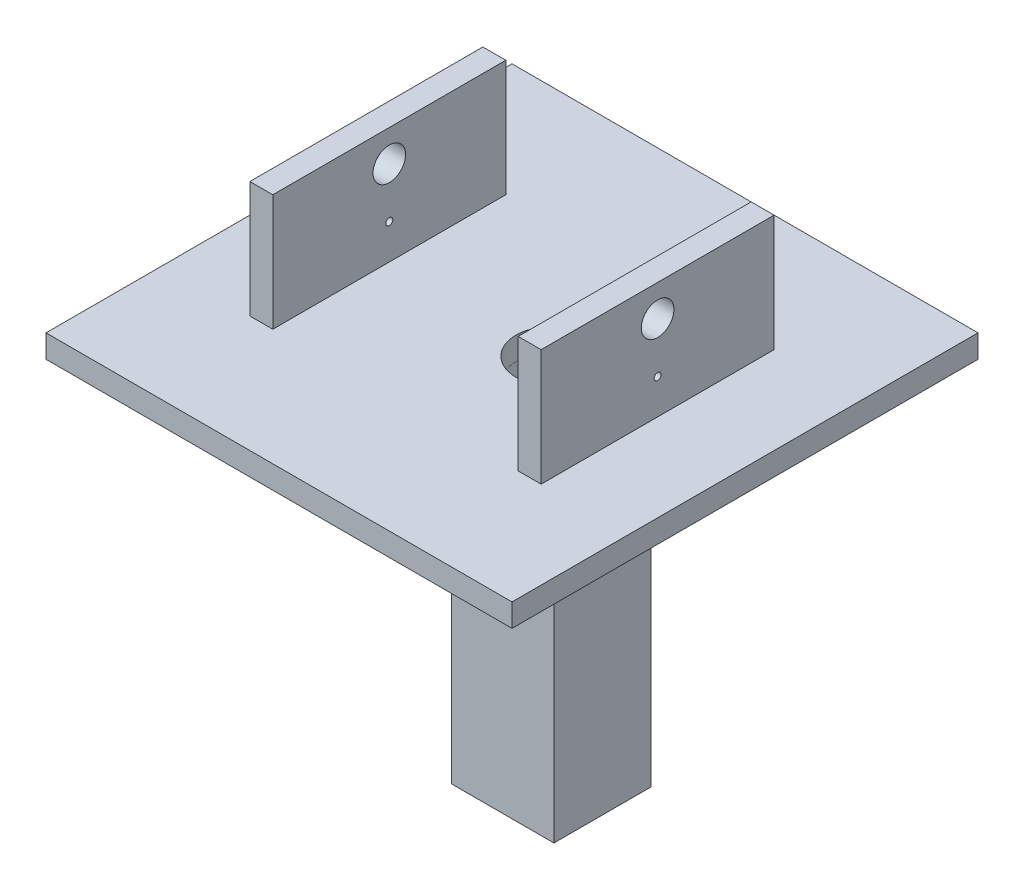
ISO-10303-21;
HEADER;
FILE_DESCRIPTION(('STEP AP214'),'2;1');
FILE_NAME('part.step','',(''),(''),'','','');
FILE_SCHEMA(('AUTOMOTIVE_DESIGN { 1 0 10303 214 1 1 1 1 }'));
ENDSEC;
DATA;
#1=APPLICATION_CONTEXT('core data for automotive mechanical design processes');
#2=APPLICATION_PROTOCOL_DEFINITION('international standard','automotive_design',2000,#1);
#3=PRODUCT_CONTEXT('',#1,'mechanical');
#4=PRODUCT('Part','Part','',(#3));
#5=PRODUCT_RELATED_PRODUCT_CATEGORY('part','',(#4));
#6=PRODUCT_DEFINITION_FORMATION('','',#4);
#7=PRODUCT_DEFINITION_CONTEXT('part definition',#1,'design');
#8=PRODUCT_DEFINITION('design','',#6,#7);
#9=PRODUCT_DEFINITION_SHAPE('','',#8);
#10=(LENGTH_UNIT() NAMED_UNIT(*) SI_UNIT(.MILLI.,.METRE.));
#11=(NAMED_UNIT(*) PLANE_ANGLE_UNIT() SI_UNIT($,.RADIAN.));
#12=(NAMED_UNIT(*) SI_UNIT($,.STERADIAN.) SOLID_ANGLE_UNIT());
#13=UNCERTAINTY_MEASURE_WITH_UNIT(LENGTH_MEASURE(1.E-05),#10,'distance_accuracy_value','');
#14=(GEOMETRIC_REPRESENTATION_CONTEXT(3) GLOBAL_UNCERTAINTY_ASSIGNED_CONTEXT((#13)) GLOBAL_UNIT_ASSIGNED_CONTEXT((#10,
#11,#12)) REPRESENTATION_CONTEXT('',''));
#15=CARTESIAN_POINT('',(0.,0.,0.));
#16=DIRECTION('',(0.,0.,1.));
#17=DIRECTION('',(1.,0.,0.));
#18=AXIS2_PLACEMENT_3D('',#15,#16,#17);
#19=CARTESIAN_POINT('',(0.,0.,0.));
#20=DIRECTION('',(0.,1.,0.));
#21=DIRECTION('',(0.,0.,1.));
#22=AXIS2_PLACEMENT_3D('',#19,#20,#21);
#23=PLANE('',#22);
#24=DIRECTION('',(0.,0.,1.));
#25=VECTOR('',#24,1.);
#26=CARTESIAN_POINT('',(0.,0.,0.));
#27=LINE('',#26,#25);
#28=CARTESIAN_POINT('',(0.,0.,0.));
#29=VERTEX_POINT('',#28);
#30=CARTESIAN_POINT('',(0.,0.,101.6));
#31=VERTEX_POINT('',#30);
#32=EDGE_CURVE('E310',#29,#31,#27,.T.);
#33=ORIENTED_EDGE('',*,*,#32,.F.);
#34=DIRECTION('',(-1.,0.,0.));
#35=VECTOR('',#34,1.);
#36=CARTESIAN_POINT('',(0.,0.,0.));
#37=LINE('',#36,#35);
#38=CARTESIAN_POINT('',(101.6,0.,0.));
#39=VERTEX_POINT('',#38);
#40=EDGE_CURVE('E316',#39,#29,#37,.T.);
#41=ORIENTED_EDGE('',*,*,#40,.F.);
#42=DIRECTION('',(0.,0.,-1.));
#43=VECTOR('',#42,1.);
#44=CARTESIAN_POINT('',(101.6,0.,0.));
#45=LINE('',#44,#43);
#46=CARTESIAN_POINT('',(101.6,0.,101.6));
#47=VERTEX_POINT('',#46);
#48=EDGE_CURVE('E332',#47,#39,#45,.T.);
#49=ORIENTED_EDGE('',*,*,#48,.F.);
#50=DIRECTION('',(1.,0.,0.));
#51=VECTOR('',#50,1.);
#52=CARTESIAN_POINT('',(0.,0.,101.6));
#53=LINE('',#52,#51);
#54=EDGE_CURVE('E329',#31,#47,#53,.T.);
#55=ORIENTED_EDGE('',*,*,#54,.F.);
#56=EDGE_LOOP('',(#33,#41,#49,#55));
#57=FACE_BOUND('',#56,.T.);
#58=DIRECTION('',(0.,0.,-1.));
#59=VECTOR('',#58,1.);
#60=CARTESIAN_POINT('',(48.1494249392775,0.,61.3607169010717));
#61=LINE('',#60,#59);
#62=CARTESIAN_POINT('',(48.1494249392775,0.,61.3607169010717));
#63=VERTEX_POINT('',#62);
#64=CARTESIAN_POINT('',(48.1494249392775,0.,40.1623354641884));
#65=VERTEX_POINT('',#64);
#66=EDGE_CURVE('E183',#63,#65,#61,.T.);
#67=ORIENTED_EDGE('',*,*,#66,.F.);
#68=DIRECTION('',(-1.,0.,0.));
#69=VECTOR('',#68,1.);
#70=CARTESIAN_POINT('',(48.1494249392775,0.,61.3607169010717));
#71=LINE('',#70,#69);
#72=CARTESIAN_POINT('',(70.4998923238175,0.,61.3607169010717));
#73=VERTEX_POINT('',#72);
#74=EDGE_CURVE('E180',#73,#63,#71,.T.);
#75=ORIENTED_EDGE('',*,*,#74,.F.);
#76=DIRECTION('',(0.,0.,1.));
#77=VECTOR('',#76,1.);
#78=CARTESIAN_POINT('',(70.4998923238175,0.,61.3607169010717));
#79=LINE('',#78,#77);
#80=CARTESIAN_POINT('',(70.4998923238175,0.,40.1623354641884));
#81=VERTEX_POINT('',#80);
#82=EDGE_CURVE('E68',#81,#73,#79,.T.);
#83=ORIENTED_EDGE('',*,*,#82,.F.);
#84=DIRECTION('',(1.,0.,0.));
#85=VECTOR('',#84,1.);
#86=CARTESIAN_POINT('',(48.1494249392775,0.,40.1623354641884));
#87=LINE('',#86,#85);
#88=EDGE_CURVE('E63',#65,#81,#87,.T.);
#89=ORIENTED_EDGE('',*,*,#88,.F.);
#90=EDGE_LOOP('',(#67,#75,#83,#89));
#91=FACE_BOUND('',#90,.T.);
#92=ADVANCED_FACE('F45',(#57,#91),#23,.F.);
#93=CARTESIAN_POINT('',(0.,5.,0.));
#94=DIRECTION('',(0.,1.,0.));
#95=DIRECTION('',(0.,0.,1.));
#96=AXIS2_PLACEMENT_3D('',#93,#94,#95);
#97=PLANE('',#96);
#98=CARTESIAN_POINT('',(59.61,5.,50.8));
#99=DIRECTION('',(0.,1.,0.));
#100=DIRECTION('',(0.,0.,1.));
#101=AXIS2_PLACEMENT_3D('',#98,#99,#100);
#102=CIRCLE('',#101,7.95020000000003);
#103=CARTESIAN_POINT('',(59.61,5.,58.7502));
#104=VERTEX_POINT('',#103);
#105=EDGE_CURVE('E199',#104,#104,#102,.T.);
#106=ORIENTED_EDGE('',*,*,#105,.F.);
#107=EDGE_LOOP('',(#106));
#108=FACE_BOUND('',#107,.T.);
#109=DIRECTION('',(0.,0.,1.));
#110=VECTOR('',#109,1.);
#111=CARTESIAN_POINT('',(0.,5.,0.));
#112=LINE('',#111,#110);
#113=CARTESIAN_POINT('',(0.,5.,0.));
#114=VERTEX_POINT('',#113);
#115=CARTESIAN_POINT('',(0.,5.,101.6));
#116=VERTEX_POINT('',#115);
#117=EDGE_CURVE('E311',#114,#116,#112,.T.);
#118=ORIENTED_EDGE('',*,*,#117,.T.);
#119=DIRECTION('',(1.,0.,0.));
#120=VECTOR('',#119,1.);
#121=CARTESIAN_POINT('',(0.,5.,101.6));
#122=LINE('',#121,#120);
#123=CARTESIAN_POINT('',(101.6,5.,101.6));
#124=VERTEX_POINT('',#123);
#125=EDGE_CURVE('E315',#116,#124,#122,.T.);
#126=ORIENTED_EDGE('',*,*,#125,.T.);
#127=DIRECTION('',(0.,0.,-1.));
#128=VECTOR('',#127,1.);
#129=CARTESIAN_POINT('',(101.6,5.,0.));
#130=LINE('',#129,#128);
#131=CARTESIAN_POINT('',(101.6,5.,0.));
#132=VERTEX_POINT('',#131);
#133=EDGE_CURVE('E319',#124,#132,#130,.T.);
#134=ORIENTED_EDGE('',*,*,#133,.T.);
#135=DIRECTION('',(-1.,0.,0.));
#136=VECTOR('',#135,1.);
#137=CARTESIAN_POINT('',(0.,5.,0.));
#138=LINE('',#137,#136);
#139=EDGE_CURVE('E322',#132,#114,#138,.T.);
#140=ORIENTED_EDGE('',*,*,#139,.T.);
#141=EDGE_LOOP('',(#118,#126,#134,#140));
#142=FACE_BOUND('',#141,.T.);
#143=DIRECTION('',(1.,0.,0.));
#144=VECTOR('',#143,1.);
#145=CARTESIAN_POINT('',(19.05,5.,76.2));
#146=LINE('',#145,#144);
#147=CARTESIAN_POINT('',(19.05,5.,76.2));
#148=VERTEX_POINT('',#147);
#149=CARTESIAN_POINT('',(24.05,5.,76.2));
#150=VERTEX_POINT('',#149);
#151=EDGE_CURVE('E288',#148,#150,#146,.T.);
#152=ORIENTED_EDGE('',*,*,#151,.F.);
#153=DIRECTION('',(0.,0.,1.));
#154=VECTOR('',#153,1.);
#155=CARTESIAN_POINT('',(19.05,5.,25.4));
#156=LINE('',#155,#154);
#157=CARTESIAN_POINT('',(19.05,5.,25.4));
#158=VERTEX_POINT('',#157);
#159=EDGE_CURVE('E269',#158,#148,#156,.T.);
#160=ORIENTED_EDGE('',*,*,#159,.F.);
#161=DIRECTION('',(-1.,0.,0.));
#162=VECTOR('',#161,1.);
#163=CARTESIAN_POINT('',(19.05,5.,25.4));
#164=LINE('',#163,#162);
#165=CARTESIAN_POINT('',(24.05,5.,25.4));
#166=VERTEX_POINT('',#165);
#167=EDGE_CURVE('E275',#166,#158,#164,.T.);
#168=ORIENTED_EDGE('',*,*,#167,.F.);
#169=DIRECTION('',(0.,0.,-1.));
#170=VECTOR('',#169,1.);
#171=CARTESIAN_POINT('',(24.05,5.,25.4));
#172=LINE('',#171,#170);
#173=EDGE_CURVE('E291',#150,#166,#172,.T.);
#174=ORIENTED_EDGE('',*,*,#173,.F.);
#175=EDGE_LOOP('',(#152,#160,#168,#174));
#176=FACE_BOUND('',#175,.T.);
#177=DIRECTION('',(1.,0.,0.));
#178=VECTOR('',#177,1.);
#179=CARTESIAN_POINT('',(77.55,5.,76.2));
#180=LINE('',#179,#178);
#181=CARTESIAN_POINT('',(77.55,5.,76.2));
#182=VERTEX_POINT('',#181);
#183=CARTESIAN_POINT('',(82.55,5.,76.2));
#184=VERTEX_POINT('',#183);
#185=EDGE_CURVE('E247',#182,#184,#180,.T.);
#186=ORIENTED_EDGE('',*,*,#185,.F.);
#187=DIRECTION('',(0.,0.,1.));
#188=VECTOR('',#187,1.);
#189=CARTESIAN_POINT('',(77.55,5.,25.4));
#190=LINE('',#189,#188);
#191=CARTESIAN_POINT('',(77.55,5.,25.4));
#192=VERTEX_POINT('',#191);
#193=EDGE_CURVE('E228',#192,#182,#190,.T.);
#194=ORIENTED_EDGE('',*,*,#193,.F.);
#195=DIRECTION('',(-1.,0.,0.));
#196=VECTOR('',#195,1.);
#197=CARTESIAN_POINT('',(77.55,5.,25.4));
#198=LINE('',#197,#196);
#199=CARTESIAN_POINT('',(82.55,5.,25.4));
#200=VERTEX_POINT('',#199);
#201=EDGE_CURVE('E234',#200,#192,#198,.T.);
#202=ORIENTED_EDGE('',*,*,#201,.F.);
#203=DIRECTION('',(0.,0.,-1.));
#204=VECTOR('',#203,1.);
#205=CARTESIAN_POINT('',(82.55,5.,25.4));
#206=LINE('',#205,#204);
#207=EDGE_CURVE('E250',#184,#200,#206,.T.);
#208=ORIENTED_EDGE('',*,*,#207,.F.);
#209=EDGE_LOOP('',(#186,#194,#202,#208));
#210=FACE_BOUND('',#209,.T.);
#211=ADVANCED_FACE('F376',(#108,#142,#176,#210),#97,.T.);
#212=CARTESIAN_POINT('',(0.,5.,0.));
#213=DIRECTION('',(1.,0.,0.));
#214=DIRECTION('',(0.,0.,-1.));
#215=AXIS2_PLACEMENT_3D('',#212,#213,#214);
#216=PLANE('',#215);
#217=ORIENTED_EDGE('',*,*,#32,.T.);
#218=DIRECTION('',(0.,-1.,0.));
#219=VECTOR('',#218,1.);
#220=CARTESIAN_POINT('',(0.,5.,101.6));
#221=LINE('',#220,#219);
#222=EDGE_CURVE('E11',#116,#31,#221,.T.);
#223=ORIENTED_EDGE('',*,*,#222,.F.);
#224=ORIENTED_EDGE('',*,*,#117,.F.);
#225=DIRECTION('',(0.,-1.,0.));
#226=VECTOR('',#225,1.);
#227=CARTESIAN_POINT('',(0.,5.,0.));
#228=LINE('',#227,#226);
#229=EDGE_CURVE('E325',#114,#29,#228,.T.);
#230=ORIENTED_EDGE('',*,*,#229,.T.);
#231=EDGE_LOOP('',(#217,#223,#224,#230));
#232=FACE_BOUND('',#231,.T.);
#233=ADVANCED_FACE('F47',(#232),#216,.F.);
#234=CARTESIAN_POINT('',(0.,5.,101.6));
#235=DIRECTION('',(0.,0.,-1.));
#236=DIRECTION('',(-1.,0.,0.));
#237=AXIS2_PLACEMENT_3D('',#234,#235,#236);
#238=PLANE('',#237);
#239=ORIENTED_EDGE('',*,*,#54,.T.);
#240=DIRECTION('',(0.,-1.,0.));
#241=VECTOR('',#240,1.);
#242=CARTESIAN_POINT('',(101.6,5.,101.6));
#243=LINE('',#242,#241);
#244=EDGE_CURVE('E55',#124,#47,#243,.T.);
#245=ORIENTED_EDGE('',*,*,#244,.F.);
#246=ORIENTED_EDGE('',*,*,#125,.F.);
#247=ORIENTED_EDGE('',*,*,#222,.T.);
#248=EDGE_LOOP('',(#239,#245,#246,#247));
#249=FACE_BOUND('',#248,.T.);
#250=ADVANCED_FACE('F412',(#249),#238,.F.);
#251=CARTESIAN_POINT('',(101.6,5.,0.));
#252=DIRECTION('',(-1.,0.,0.));
#253=DIRECTION('',(0.,0.,1.));
#254=AXIS2_PLACEMENT_3D('',#251,#252,#253);
#255=PLANE('',#254);
#256=ORIENTED_EDGE('',*,*,#48,.T.);
#257=DIRECTION('',(0.,-1.,0.));
#258=VECTOR('',#257,1.);
#259=CARTESIAN_POINT('',(101.6,5.,0.));
#260=LINE('',#259,#258);
#261=EDGE_CURVE('E340',#132,#39,#260,.T.);
#262=ORIENTED_EDGE('',*,*,#261,.F.);
#263=ORIENTED_EDGE('',*,*,#133,.F.);
#264=ORIENTED_EDGE('',*,*,#244,.T.);
#265=EDGE_LOOP('',(#256,#262,#263,#264));
#266=FACE_BOUND('',#265,.T.);
#267=ADVANCED_FACE('F409',(#266),#255,.F.);
#268=CARTESIAN_POINT('',(0.,5.,0.));
#269=DIRECTION('',(0.,0.,1.));
#270=DIRECTION('',(1.,0.,0.));
#271=AXIS2_PLACEMENT_3D('',#268,#269,#270);
#272=PLANE('',#271);
#273=ORIENTED_EDGE('',*,*,#40,.T.);
#274=ORIENTED_EDGE('',*,*,#229,.F.);
#275=ORIENTED_EDGE('',*,*,#139,.F.);
#276=ORIENTED_EDGE('',*,*,#261,.T.);
#277=EDGE_LOOP('',(#273,#274,#275,#276));
#278=FACE_BOUND('',#277,.T.);
#279=ADVANCED_FACE('F405',(#278),#272,.F.);
#280=CARTESIAN_POINT('',(19.05,30.4,25.4));
#281=DIRECTION('',(1.,0.,0.));
#282=DIRECTION('',(0.,0.,-1.));
#283=AXIS2_PLACEMENT_3D('',#280,#281,#282);
#284=PLANE('',#283);
#285=CARTESIAN_POINT('',(19.05,12.62,50.8));
#286=DIRECTION('',(-1.,0.,0.));
#287=DIRECTION('',(0.,0.,1.));
#288=AXIS2_PLACEMENT_3D('',#285,#286,#287);
#289=CIRCLE('',#288,0.761999999999996);
#290=CARTESIAN_POINT('',(19.05,12.62,51.562));
#291=VERTEX_POINT('',#290);
#292=EDGE_CURVE('E185',#291,#291,#289,.T.);
#293=ORIENTED_EDGE('',*,*,#292,.F.);
#294=EDGE_LOOP('',(#293));
#295=FACE_BOUND('',#294,.T.);
#296=CARTESIAN_POINT('',(19.05,23.542,50.8));
#297=DIRECTION('',(-1.,0.,0.));
#298=DIRECTION('',(0.,0.,1.));
#299=AXIS2_PLACEMENT_3D('',#296,#297,#298);
#300=CIRCLE('',#299,3.55600000000001);
#301=CARTESIAN_POINT('',(19.05,23.542,54.356));
#302=VERTEX_POINT('',#301);
#303=EDGE_CURVE('E215',#302,#302,#300,.T.);
#304=ORIENTED_EDGE('',*,*,#303,.F.);
#305=EDGE_LOOP('',(#304));
#306=FACE_BOUND('',#305,.T.);
#307=ORIENTED_EDGE('',*,*,#159,.T.);
#308=DIRECTION('',(0.,-1.,0.));
#309=VECTOR('',#308,1.);
#310=CARTESIAN_POINT('',(19.05,30.4,76.2));
#311=LINE('',#310,#309);
#312=CARTESIAN_POINT('',(19.05,30.4,76.2));
#313=VERTEX_POINT('',#312);
#314=EDGE_CURVE('E307',#313,#148,#311,.T.);
#315=ORIENTED_EDGE('',*,*,#314,.F.);
#316=DIRECTION('',(0.,0.,1.));
#317=VECTOR('',#316,1.);
#318=CARTESIAN_POINT('',(19.05,30.4,25.4));
#319=LINE('',#318,#317);
#320=CARTESIAN_POINT('',(19.05,30.4,25.4));
#321=VERTEX_POINT('',#320);
#322=EDGE_CURVE('E270',#321,#313,#319,.T.);
#323=ORIENTED_EDGE('',*,*,#322,.F.);
#324=DIRECTION('',(0.,-1.,0.));
#325=VECTOR('',#324,1.);
#326=CARTESIAN_POINT('',(19.05,30.4,25.4));
#327=LINE('',#326,#325);
#328=EDGE_CURVE('E284',#321,#158,#327,.T.);
#329=ORIENTED_EDGE('',*,*,#328,.T.);
#330=EDGE_LOOP('',(#307,#315,#323,#329));
#331=FACE_BOUND('',#330,.T.);
#332=ADVANCED_FACE('F408',(#295,#306,#331),#284,.F.);
#333=CARTESIAN_POINT('',(19.05,30.4,76.2));
#334=DIRECTION('',(0.,0.,-1.));
#335=DIRECTION('',(-1.,0.,0.));
#336=AXIS2_PLACEMENT_3D('',#333,#334,#335);
#337=PLANE('',#336);
#338=ORIENTED_EDGE('',*,*,#151,.T.);
#339=DIRECTION('',(0.,-1.,0.));
#340=VECTOR('',#339,1.);
#341=CARTESIAN_POINT('',(24.05,30.4,76.2));
#342=LINE('',#341,#340);
#343=CARTESIAN_POINT('',(24.05,30.4,76.2));
#344=VERTEX_POINT('',#343);
#345=EDGE_CURVE('E303',#344,#150,#342,.T.);
#346=ORIENTED_EDGE('',*,*,#345,.F.);
#347=DIRECTION('',(1.,0.,0.));
#348=VECTOR('',#347,1.);
#349=CARTESIAN_POINT('',(19.05,30.4,76.2));
#350=LINE('',#349,#348);
#351=EDGE_CURVE('E274',#313,#344,#350,.T.);
#352=ORIENTED_EDGE('',*,*,#351,.F.);
#353=ORIENTED_EDGE('',*,*,#314,.T.);
#354=EDGE_LOOP('',(#338,#346,#352,#353));
#355=FACE_BOUND('',#354,.T.);
#356=ADVANCED_FACE('F437',(#355),#337,.F.);
#357=CARTESIAN_POINT('',(24.05,30.4,25.4));
#358=DIRECTION('',(-1.,0.,0.));
#359=DIRECTION('',(0.,0.,1.));
#360=AXIS2_PLACEMENT_3D('',#357,#358,#359);
#361=PLANE('',#360);
#362=CARTESIAN_POINT('',(24.05,12.62,50.8));
#363=DIRECTION('',(-1.,0.,0.));
#364=DIRECTION('',(0.,0.,1.));
#365=AXIS2_PLACEMENT_3D('',#362,#363,#364);
#366=CIRCLE('',#365,0.761999999999996);
#367=CARTESIAN_POINT('',(24.05,12.62,51.562));
#368=VERTEX_POINT('',#367);
#369=EDGE_CURVE('E190',#368,#368,#366,.F.);
#370=ORIENTED_EDGE('',*,*,#369,.F.);
#371=EDGE_LOOP('',(#370));
#372=FACE_BOUND('',#371,.T.);
#373=CARTESIAN_POINT('',(24.05,23.542,50.8));
#374=DIRECTION('',(-1.,0.,0.));
#375=DIRECTION('',(0.,0.,1.));
#376=AXIS2_PLACEMENT_3D('',#373,#374,#375);
#377=CIRCLE('',#376,3.55600000000001);
#378=CARTESIAN_POINT('',(24.05,23.542,54.356));
#379=VERTEX_POINT('',#378);
#380=EDGE_CURVE('E224',#379,#379,#377,.T.);
#381=ORIENTED_EDGE('',*,*,#380,.T.);
#382=EDGE_LOOP('',(#381));
#383=FACE_BOUND('',#382,.T.);
#384=ORIENTED_EDGE('',*,*,#173,.T.);
#385=DIRECTION('',(0.,-1.,0.));
#386=VECTOR('',#385,1.);
#387=CARTESIAN_POINT('',(24.05,30.4,25.4));
#388=LINE('',#387,#386);
#389=CARTESIAN_POINT('',(24.05,30.4,25.4));
#390=VERTEX_POINT('',#389);
#391=EDGE_CURVE('E300',#390,#166,#388,.T.);
#392=ORIENTED_EDGE('',*,*,#391,.F.);
#393=DIRECTION('',(0.,0.,-1.));
#394=VECTOR('',#393,1.);
#395=CARTESIAN_POINT('',(24.05,30.4,25.4));
#396=LINE('',#395,#394);
#397=EDGE_CURVE('E278',#344,#390,#396,.T.);
#398=ORIENTED_EDGE('',*,*,#397,.F.);
#399=ORIENTED_EDGE('',*,*,#345,.T.);
#400=EDGE_LOOP('',(#384,#392,#398,#399));
#401=FACE_BOUND('',#400,.T.);
#402=ADVANCED_FACE('F441',(#372,#383,#401),#361,.F.);
#403=CARTESIAN_POINT('',(19.05,30.4,25.4));
#404=DIRECTION('',(0.,0.,1.));
#405=DIRECTION('',(1.,0.,0.));
#406=AXIS2_PLACEMENT_3D('',#403,#404,#405);
#407=PLANE('',#406);
#408=ORIENTED_EDGE('',*,*,#167,.T.);
#409=ORIENTED_EDGE('',*,*,#328,.F.);
#410=DIRECTION('',(-1.,0.,0.));
#411=VECTOR('',#410,1.);
#412=CARTESIAN_POINT('',(19.05,30.4,25.4));
#413=LINE('',#412,#411);
#414=EDGE_CURVE('E281',#390,#321,#413,.T.);
#415=ORIENTED_EDGE('',*,*,#414,.F.);
#416=ORIENTED_EDGE('',*,*,#391,.T.);
#417=EDGE_LOOP('',(#408,#409,#415,#416));
#418=FACE_BOUND('',#417,.T.);
#419=ADVANCED_FACE('F449',(#418),#407,.F.);
#420=CARTESIAN_POINT('',(0.,30.4,0.));
#421=DIRECTION('',(0.,1.,0.));
#422=DIRECTION('',(0.,0.,1.));
#423=AXIS2_PLACEMENT_3D('',#420,#421,#422);
#424=PLANE('',#423);
#425=ORIENTED_EDGE('',*,*,#322,.T.);
#426=ORIENTED_EDGE('',*,*,#351,.T.);
#427=ORIENTED_EDGE('',*,*,#397,.T.);
#428=ORIENTED_EDGE('',*,*,#414,.T.);
#429=EDGE_LOOP('',(#425,#426,#427,#428));
#430=FACE_BOUND('',#429,.T.);
#431=ADVANCED_FACE('F365',(#430),#424,.T.);
#432=CARTESIAN_POINT('',(77.55,30.4,25.4));
#433=DIRECTION('',(1.,0.,0.));
#434=DIRECTION('',(0.,0.,-1.));
#435=AXIS2_PLACEMENT_3D('',#432,#433,#434);
#436=PLANE('',#435);
#437=CARTESIAN_POINT('',(77.55,12.62,50.8));
#438=DIRECTION('',(1.,0.,0.));
#439=DIRECTION('',(0.,0.,-1.));
#440=AXIS2_PLACEMENT_3D('',#437,#438,#439);
#441=CIRCLE('',#440,0.761999999999996);
#442=CARTESIAN_POINT('',(77.55,12.62,50.038));
#443=VERTEX_POINT('',#442);
#444=EDGE_CURVE('E204',#443,#443,#441,.F.);
#445=ORIENTED_EDGE('',*,*,#444,.F.);
#446=EDGE_LOOP('',(#445));
#447=FACE_BOUND('',#446,.T.);
#448=CARTESIAN_POINT('',(77.55,23.542,50.8));
#449=DIRECTION('',(1.,0.,0.));
#450=DIRECTION('',(0.,0.,-1.));
#451=AXIS2_PLACEMENT_3D('',#448,#449,#450);
#452=CIRCLE('',#451,3.55600000000001);
#453=CARTESIAN_POINT('',(77.55,23.542,47.244));
#454=VERTEX_POINT('',#453);
#455=EDGE_CURVE('E220',#454,#454,#452,.T.);
#456=ORIENTED_EDGE('',*,*,#455,.T.);
#457=EDGE_LOOP('',(#456));
#458=FACE_BOUND('',#457,.T.);
#459=ORIENTED_EDGE('',*,*,#193,.T.);
#460=DIRECTION('',(0.,-1.,0.));
#461=VECTOR('',#460,1.);
#462=CARTESIAN_POINT('',(77.55,30.4,76.2));
#463=LINE('',#462,#461);
#464=CARTESIAN_POINT('',(77.55,30.4,76.2));
#465=VERTEX_POINT('',#464);
#466=EDGE_CURVE('E266',#465,#182,#463,.T.);
#467=ORIENTED_EDGE('',*,*,#466,.F.);
#468=DIRECTION('',(0.,0.,1.));
#469=VECTOR('',#468,1.);
#470=CARTESIAN_POINT('',(77.55,30.4,25.4));
#471=LINE('',#470,#469);
#472=CARTESIAN_POINT('',(77.55,30.4,25.4));
#473=VERTEX_POINT('',#472);
#474=EDGE_CURVE('E229',#473,#465,#471,.T.);
#475=ORIENTED_EDGE('',*,*,#474,.F.);
#476=DIRECTION('',(0.,-1.,0.));
#477=VECTOR('',#476,1.);
#478=CARTESIAN_POINT('',(77.55,30.4,25.4));
#479=LINE('',#478,#477);
#480=EDGE_CURVE('E243',#473,#192,#479,.T.);
#481=ORIENTED_EDGE('',*,*,#480,.T.);
#482=EDGE_LOOP('',(#459,#467,#475,#481));
#483=FACE_BOUND('',#482,.T.);
#484=ADVANCED_FACE('F361',(#447,#458,#483),#436,.F.);
#485=CARTESIAN_POINT('',(77.55,30.4,76.2));
#486=DIRECTION('',(0.,0.,-1.));
#487=DIRECTION('',(-1.,0.,0.));
#488=AXIS2_PLACEMENT_3D('',#485,#486,#487);
#489=PLANE('',#488);
#490=ORIENTED_EDGE('',*,*,#185,.T.);
#491=DIRECTION('',(0.,-1.,0.));
#492=VECTOR('',#491,1.);
#493=CARTESIAN_POINT('',(82.55,30.4,76.2));
#494=LINE('',#493,#492);
#495=CARTESIAN_POINT('',(82.55,30.4,76.2));
#496=VERTEX_POINT('',#495);
#497=EDGE_CURVE('E262',#496,#184,#494,.T.);
#498=ORIENTED_EDGE('',*,*,#497,.F.);
#499=DIRECTION('',(1.,0.,0.));
#500=VECTOR('',#499,1.);
#501=CARTESIAN_POINT('',(77.55,30.4,76.2));
#502=LINE('',#501,#500);
#503=EDGE_CURVE('E233',#465,#496,#502,.T.);
#504=ORIENTED_EDGE('',*,*,#503,.F.);
#505=ORIENTED_EDGE('',*,*,#466,.T.);
#506=EDGE_LOOP('',(#490,#498,#504,#505));
#507=FACE_BOUND('',#506,.T.);
#508=ADVANCED_FACE('F364',(#507),#489,.F.);
#509=CARTESIAN_POINT('',(82.55,30.4,25.4));
#510=DIRECTION('',(-1.,0.,0.));
#511=DIRECTION('',(0.,0.,1.));
#512=AXIS2_PLACEMENT_3D('',#509,#510,#511);
#513=PLANE('',#512);
#514=CARTESIAN_POINT('',(82.55,12.62,50.8));
#515=DIRECTION('',(1.,0.,0.));
#516=DIRECTION('',(0.,0.,-1.));
#517=AXIS2_PLACEMENT_3D('',#514,#515,#516);
#518=CIRCLE('',#517,0.761999999999996);
#519=CARTESIAN_POINT('',(82.55,12.62,50.038));
#520=VERTEX_POINT('',#519);
#521=EDGE_CURVE('E211',#520,#520,#518,.T.);
#522=ORIENTED_EDGE('',*,*,#521,.F.);
#523=EDGE_LOOP('',(#522));
#524=FACE_BOUND('',#523,.T.);
#525=CARTESIAN_POINT('',(82.55,23.542,50.8));
#526=DIRECTION('',(-1.,0.,0.));
#527=DIRECTION('',(0.,0.,1.));
#528=AXIS2_PLACEMENT_3D('',#525,#526,#527);
#529=CIRCLE('',#528,3.55600000000001);
#530=CARTESIAN_POINT('',(82.55,23.542,54.356));
#531=VERTEX_POINT('',#530);
#532=EDGE_CURVE('E219',#531,#531,#529,.T.);
#533=ORIENTED_EDGE('',*,*,#532,.T.);
#534=EDGE_LOOP('',(#533));
#535=FACE_BOUND('',#534,.T.);
#536=ORIENTED_EDGE('',*,*,#207,.T.);
#537=DIRECTION('',(0.,-1.,0.));
#538=VECTOR('',#537,1.);
#539=CARTESIAN_POINT('',(82.55,30.4,25.4));
#540=LINE('',#539,#538);
#541=CARTESIAN_POINT('',(82.55,30.4,25.4));
#542=VERTEX_POINT('',#541);
#543=EDGE_CURVE('E259',#542,#200,#540,.T.);
#544=ORIENTED_EDGE('',*,*,#543,.F.);
#545=DIRECTION('',(0.,0.,-1.));
#546=VECTOR('',#545,1.);
#547=CARTESIAN_POINT('',(82.55,30.4,25.4));
#548=LINE('',#547,#546);
#549=EDGE_CURVE('E237',#496,#542,#548,.T.);
#550=ORIENTED_EDGE('',*,*,#549,.F.);
#551=ORIENTED_EDGE('',*,*,#497,.T.);
#552=EDGE_LOOP('',(#536,#544,#550,#551));
#553=FACE_BOUND('',#552,.T.);
#554=ADVANCED_FACE('F350',(#524,#535,#553),#513,.F.);
#555=CARTESIAN_POINT('',(77.55,30.4,25.4));
#556=DIRECTION('',(0.,0.,1.));
#557=DIRECTION('',(1.,0.,0.));
#558=AXIS2_PLACEMENT_3D('',#555,#556,#557);
#559=PLANE('',#558);
#560=ORIENTED_EDGE('',*,*,#201,.T.);
#561=ORIENTED_EDGE('',*,*,#480,.F.);
#562=DIRECTION('',(-1.,0.,0.));
#563=VECTOR('',#562,1.);
#564=CARTESIAN_POINT('',(77.55,30.4,25.4));
#565=LINE('',#564,#563);
#566=EDGE_CURVE('E240',#542,#473,#565,.T.);
#567=ORIENTED_EDGE('',*,*,#566,.F.);
#568=ORIENTED_EDGE('',*,*,#543,.T.);
#569=EDGE_LOOP('',(#560,#561,#567,#568));
#570=FACE_BOUND('',#569,.T.);
#571=ADVANCED_FACE('F384',(#570),#559,.F.);
#572=CARTESIAN_POINT('',(0.,30.4,0.));
#573=DIRECTION('',(0.,1.,0.));
#574=DIRECTION('',(0.,0.,1.));
#575=AXIS2_PLACEMENT_3D('',#572,#573,#574);
#576=PLANE('',#575);
#577=ORIENTED_EDGE('',*,*,#474,.T.);
#578=ORIENTED_EDGE('',*,*,#503,.T.);
#579=ORIENTED_EDGE('',*,*,#549,.T.);
#580=ORIENTED_EDGE('',*,*,#566,.T.);
#581=EDGE_LOOP('',(#577,#578,#579,#580));
#582=FACE_BOUND('',#581,.T.);
#583=ADVANCED_FACE('F357',(#582),#576,.T.);
#584=CARTESIAN_POINT('',(101.6,23.542,50.8));
#585=DIRECTION('',(-1.,0.,0.));
#586=DIRECTION('',(0.,0.,1.));
#587=AXIS2_PLACEMENT_3D('',#584,#585,#586);
#588=CYLINDRICAL_SURFACE('',#587,3.55600000000001);
#589=ORIENTED_EDGE('',*,*,#532,.F.);
#590=EDGE_LOOP('',(#589));
#591=FACE_BOUND('',#590,.T.);
#592=ORIENTED_EDGE('',*,*,#455,.F.);
#593=EDGE_LOOP('',(#592));
#594=FACE_BOUND('',#593,.T.);
#595=ADVANCED_FACE('F353',(#591,#594),#588,.F.);
#596=ORIENTED_EDGE('',*,*,#303,.T.);
#597=EDGE_LOOP('',(#596));
#598=FACE_BOUND('',#597,.T.);
#599=ORIENTED_EDGE('',*,*,#380,.F.);
#600=EDGE_LOOP('',(#599));
#601=FACE_BOUND('',#600,.T.);
#602=ADVANCED_FACE('F356',(#598,#601),#588,.F.);
#603=CARTESIAN_POINT('',(-0.001000000000001,12.62,50.8));
#604=DIRECTION('',(1.,0.,0.));
#605=DIRECTION('',(0.,0.,-1.));
#606=AXIS2_PLACEMENT_3D('',#603,#604,#605);
#607=CYLINDRICAL_SURFACE('',#606,0.761999999999996);
#608=CARTESIAN_POINT('',(82.55,12.62,50.038));
#609=CARTESIAN_POINT('',(82.4979166666667,12.62,50.038));
#610=CARTESIAN_POINT('',(82.4458333333333,12.62,50.038));
#611=CARTESIAN_POINT('',(82.3416666666667,12.62,50.038));
#612=CARTESIAN_POINT('',(82.2895833333333,12.62,50.038));
#613=CARTESIAN_POINT('',(82.1854166666667,12.62,50.038));
#614=CARTESIAN_POINT('',(82.1333333333333,12.62,50.038));
#615=CARTESIAN_POINT('',(82.0291666666667,12.62,50.038));
#616=CARTESIAN_POINT('',(81.9770833333333,12.62,50.038));
#617=CARTESIAN_POINT('',(81.8729166666667,12.62,50.038));
#618=CARTESIAN_POINT('',(81.8208333333333,12.62,50.038));
#619=CARTESIAN_POINT('',(81.7166666666667,12.62,50.038));
#620=CARTESIAN_POINT('',(81.6645833333333,12.62,50.038));
#621=CARTESIAN_POINT('',(81.5604166666667,12.62,50.038));
#622=CARTESIAN_POINT('',(81.5083333333333,12.62,50.038));
#623=CARTESIAN_POINT('',(81.4041666666667,12.62,50.038));
#624=CARTESIAN_POINT('',(81.3520833333333,12.62,50.038));
#625=CARTESIAN_POINT('',(81.2479166666667,12.62,50.038));
#626=CARTESIAN_POINT('',(81.1958333333333,12.62,50.038));
#627=CARTESIAN_POINT('',(81.0916666666667,12.62,50.038));
#628=CARTESIAN_POINT('',(81.0395833333333,12.62,50.038));
#629=CARTESIAN_POINT('',(80.9354166666667,12.62,50.038));
#630=CARTESIAN_POINT('',(80.8833333333333,12.62,50.038));
#631=CARTESIAN_POINT('',(80.7791666666667,12.62,50.038));
#632=CARTESIAN_POINT('',(80.7270833333333,12.62,50.038));
#633=CARTESIAN_POINT('',(80.6229166666667,12.62,50.038));
#634=CARTESIAN_POINT('',(80.5708333333333,12.62,50.038));
#635=CARTESIAN_POINT('',(80.4666666666667,12.62,50.038));
#636=CARTESIAN_POINT('',(80.4145833333333,12.62,50.038));
#637=CARTESIAN_POINT('',(80.3104166666667,12.62,50.038));
#638=CARTESIAN_POINT('',(80.2583333333333,12.62,50.038));
#639=CARTESIAN_POINT('',(80.1541666666667,12.62,50.038));
#640=CARTESIAN_POINT('',(80.1020833333333,12.62,50.038));
#641=CARTESIAN_POINT('',(79.9979166666667,12.62,50.038));
#642=CARTESIAN_POINT('',(79.9458333333333,12.62,50.038));
#643=CARTESIAN_POINT('',(79.8416666666667,12.62,50.038));
#644=CARTESIAN_POINT('',(79.7895833333333,12.62,50.038));
#645=CARTESIAN_POINT('',(79.6854166666667,12.62,50.038));
#646=CARTESIAN_POINT('',(79.6333333333333,12.62,50.038));
#647=CARTESIAN_POINT('',(79.5291666666667,12.62,50.038));
#648=CARTESIAN_POINT('',(79.4770833333333,12.62,50.038));
#649=CARTESIAN_POINT('',(79.3729166666667,12.62,50.038));
#650=CARTESIAN_POINT('',(79.3208333333333,12.62,50.038));
#651=CARTESIAN_POINT('',(79.2166666666667,12.62,50.038));
#652=CARTESIAN_POINT('',(79.1645833333333,12.62,50.038));
#653=CARTESIAN_POINT('',(79.0604166666667,12.62,50.038));
#654=CARTESIAN_POINT('',(79.0083333333333,12.62,50.038));
#655=CARTESIAN_POINT('',(78.9041666666667,12.62,50.038));
#656=CARTESIAN_POINT('',(78.8520833333333,12.62,50.038));
#657=CARTESIAN_POINT('',(78.7479166666667,12.62,50.038));
#658=CARTESIAN_POINT('',(78.6958333333333,12.62,50.038));
#659=CARTESIAN_POINT('',(78.5916666666667,12.62,50.038));
#660=CARTESIAN_POINT('',(78.5395833333333,12.62,50.038));
#661=CARTESIAN_POINT('',(78.4354166666667,12.62,50.038));
#662=CARTESIAN_POINT('',(78.3833333333333,12.62,50.038));
#663=CARTESIAN_POINT('',(78.2791666666667,12.62,50.038));
#664=CARTESIAN_POINT('',(78.2270833333333,12.62,50.038));
#665=CARTESIAN_POINT('',(78.1229166666667,12.62,50.038));
#666=CARTESIAN_POINT('',(78.0708333333333,12.62,50.038));
#667=CARTESIAN_POINT('',(77.9666666666667,12.62,50.038));
#668=CARTESIAN_POINT('',(77.9145833333333,12.62,50.038));
#669=CARTESIAN_POINT('',(77.8104166666667,12.62,50.038));
#670=CARTESIAN_POINT('',(77.7583333333333,12.62,50.038));
#671=CARTESIAN_POINT('',(77.6541666666667,12.62,50.038));
#672=CARTESIAN_POINT('',(77.6020833333333,12.62,50.038));
#673=CARTESIAN_POINT('',(77.55,12.62,50.038));
#674=B_SPLINE_CURVE_WITH_KNOTS('',3,(#608,#609,#610,#611,#612,#613,#614,#615,#616,#617,#618,
#619,#620,#621,#622,#623,#624,#625,#626,#627,#628,#629,#630,#631,#632,#633,#634,#635,#636,#637,
#638,#639,#640,#641,#642,#643,#644,#645,#646,#647,#648,#649,#650,#651,#652,#653,#654,#655,#656,
#657,#658,#659,#660,#661,#662,#663,#664,#665,#666,#667,#668,#669,#670,#671,#672,#673),
.UNSPECIFIED.,.F.,.F.,(4,2,2,2,2,2,2,2,2,2,2,2,2,2,2,2,2,2,2,2,2,2,2,2,2,2,2,2,2,2,2,2,4),(0.,
0.156249999999997,0.312499999999993,0.468750000000004,0.625000000000001,0.781249999999997,
0.937500000000008,1.09375,1.25,1.40625,1.56249999999999,1.71875,1.875,2.03125,2.18750000000001,
2.34375000000001,2.5,2.65625,2.8125,2.96875000000001,3.125,3.28125,3.43750000000001,
3.59375000000001,3.75,3.90625,4.0625,4.21875000000001,4.375,4.53125,4.68750000000001,
4.84375000000001,5.),.UNSPECIFIED.);
#675=EDGE_CURVE('BSEAM471',#520,#443,#674,.T.);
#676=ORIENTED_EDGE('',*,*,#521,.T.);
#677=ORIENTED_EDGE('',*,*,#444,.T.);
#678=ORIENTED_EDGE('',*,*,#675,.T.);
#679=ORIENTED_EDGE('',*,*,#675,.F.);
#680=EDGE_LOOP('',(#676,#678,#677,#679));
#681=FACE_BOUND('',#680,.T.);
#682=ADVANCED_FACE('F471',(#681),#607,.F.);
#683=CARTESIAN_POINT('',(59.61,0.,50.8));
#684=DIRECTION('',(0.,1.,0.));
#685=DIRECTION('',(0.,0.,1.));
#686=AXIS2_PLACEMENT_3D('',#683,#684,#685);
#687=CYLINDRICAL_SURFACE('',#686,7.95020000000003);
#688=CARTESIAN_POINT('',(59.61,0.,50.8));
#689=DIRECTION('',(0.,1.,0.));
#690=DIRECTION('',(0.,0.,1.));
#691=AXIS2_PLACEMENT_3D('',#688,#689,#690);
#692=CIRCLE('',#691,7.95020000000003);
#693=CARTESIAN_POINT('',(59.61,0.,58.7502));
#694=VERTEX_POINT('',#693);
#695=EDGE_CURVE('E200',#694,#694,#692,.T.);
#696=ORIENTED_EDGE('',*,*,#695,.F.);
#697=EDGE_LOOP('',(#696));
#698=FACE_BOUND('',#697,.T.);
#699=ORIENTED_EDGE('',*,*,#105,.T.);
#700=EDGE_LOOP('',(#699));
#701=FACE_BOUND('',#700,.T.);
#702=ADVANCED_FACE('F477',(#698,#701),#687,.F.);
#703=CARTESIAN_POINT('',(101.601,12.62,50.8));
#704=DIRECTION('',(-1.,0.,0.));
#705=DIRECTION('',(0.,0.,1.));
#706=AXIS2_PLACEMENT_3D('',#703,#704,#705);
#707=CYLINDRICAL_SURFACE('',#706,0.761999999999996);
#708=CARTESIAN_POINT('',(19.05,12.62,51.562));
#709=CARTESIAN_POINT('',(19.1020833333333,12.62,51.562));
#710=CARTESIAN_POINT('',(19.1541666666667,12.62,51.562));
#711=CARTESIAN_POINT('',(19.2583333333333,12.62,51.562));
#712=CARTESIAN_POINT('',(19.3104166666667,12.62,51.562));
#713=CARTESIAN_POINT('',(19.4145833333333,12.62,51.562));
#714=CARTESIAN_POINT('',(19.4666666666667,12.62,51.562));
#715=CARTESIAN_POINT('',(19.5708333333333,12.62,51.562));
#716=CARTESIAN_POINT('',(19.6229166666667,12.62,51.562));
#717=CARTESIAN_POINT('',(19.7270833333333,12.62,51.562));
#718=CARTESIAN_POINT('',(19.7791666666667,12.62,51.562));
#719=CARTESIAN_POINT('',(19.8833333333333,12.62,51.562));
#720=CARTESIAN_POINT('',(19.9354166666667,12.62,51.562));
#721=CARTESIAN_POINT('',(20.0395833333333,12.62,51.562));
#722=CARTESIAN_POINT('',(20.0916666666667,12.62,51.562));
#723=CARTESIAN_POINT('',(20.1958333333333,12.62,51.562));
#724=CARTESIAN_POINT('',(20.2479166666667,12.62,51.562));
#725=CARTESIAN_POINT('',(20.3520833333333,12.62,51.562));
#726=CARTESIAN_POINT('',(20.4041666666667,12.62,51.562));
#727=CARTESIAN_POINT('',(20.5083333333333,12.62,51.562));
#728=CARTESIAN_POINT('',(20.5604166666667,12.62,51.562));
#729=CARTESIAN_POINT('',(20.6645833333333,12.62,51.562));
#730=CARTESIAN_POINT('',(20.7166666666667,12.62,51.562));
#731=CARTESIAN_POINT('',(20.8208333333333,12.62,51.562));
#732=CARTESIAN_POINT('',(20.8729166666667,12.62,51.562));
#733=CARTESIAN_POINT('',(20.9770833333333,12.62,51.562));
#734=CARTESIAN_POINT('',(21.0291666666667,12.62,51.562));
#735=CARTESIAN_POINT('',(21.1333333333333,12.62,51.562));
#736=CARTESIAN_POINT('',(21.1854166666667,12.62,51.562));
#737=CARTESIAN_POINT('',(21.2895833333333,12.62,51.562));
#738=CARTESIAN_POINT('',(21.3416666666667,12.62,51.562));
#739=CARTESIAN_POINT('',(21.4458333333333,12.62,51.562));
#740=CARTESIAN_POINT('',(21.4979166666667,12.62,51.562));
#741=CARTESIAN_POINT('',(21.6020833333333,12.62,51.562));
#742=CARTESIAN_POINT('',(21.6541666666667,12.62,51.562));
#743=CARTESIAN_POINT('',(21.7583333333333,12.62,51.562));
#744=CARTESIAN_POINT('',(21.8104166666667,12.62,51.562));
#745=CARTESIAN_POINT('',(21.9145833333333,12.62,51.562));
#746=CARTESIAN_POINT('',(21.9666666666667,12.62,51.562));
#747=CARTESIAN_POINT('',(22.0708333333333,12.62,51.562));
#748=CARTESIAN_POINT('',(22.1229166666667,12.62,51.562));
#749=CARTESIAN_POINT('',(22.2270833333333,12.62,51.562));
#750=CARTESIAN_POINT('',(22.2791666666667,12.62,51.562));
#751=CARTESIAN_POINT('',(22.3833333333333,12.62,51.562));
#752=CARTESIAN_POINT('',(22.4354166666667,12.62,51.562));
#753=CARTESIAN_POINT('',(22.5395833333333,12.62,51.562));
#754=CARTESIAN_POINT('',(22.5916666666667,12.62,51.562));
#755=CARTESIAN_POINT('',(22.6958333333333,12.62,51.562));
#756=CARTESIAN_POINT('',(22.7479166666667,12.62,51.562));
#757=CARTESIAN_POINT('',(22.8520833333333,12.62,51.562));
#758=CARTESIAN_POINT('',(22.9041666666667,12.62,51.562));
#759=CARTESIAN_POINT('',(23.0083333333333,12.62,51.562));
#760=CARTESIAN_POINT('',(23.0604166666667,12.62,51.562));
#761=CARTESIAN_POINT('',(23.1645833333333,12.62,51.562));
#762=CARTESIAN_POINT('',(23.2166666666667,12.62,51.562));
#763=CARTESIAN_POINT('',(23.3208333333333,12.62,51.562));
#764=CARTESIAN_POINT('',(23.3729166666667,12.62,51.562));
#765=CARTESIAN_POINT('',(23.4770833333333,12.62,51.562));
#766=CARTESIAN_POINT('',(23.5291666666667,12.62,51.562));
#767=CARTESIAN_POINT('',(23.6333333333333,12.62,51.562));
#768=CARTESIAN_POINT('',(23.6854166666667,12.62,51.562));
#769=CARTESIAN_POINT('',(23.7895833333333,12.62,51.562));
#770=CARTESIAN_POINT('',(23.8416666666667,12.62,51.562));
#771=CARTESIAN_POINT('',(23.9458333333333,12.62,51.562));
#772=CARTESIAN_POINT('',(23.9979166666667,12.62,51.562));
#773=CARTESIAN_POINT('',(24.05,12.62,51.562));
#774=B_SPLINE_CURVE_WITH_KNOTS('',3,(#708,#709,#710,#711,#712,#713,#714,#715,#716,#717,#718,
#719,#720,#721,#722,#723,#724,#725,#726,#727,#728,#729,#730,#731,#732,#733,#734,#735,#736,#737,
#738,#739,#740,#741,#742,#743,#744,#745,#746,#747,#748,#749,#750,#751,#752,#753,#754,#755,#756,
#757,#758,#759,#760,#761,#762,#763,#764,#765,#766,#767,#768,#769,#770,#771,#772,#773),
.UNSPECIFIED.,.F.,.F.,(4,2,2,2,2,2,2,2,2,2,2,2,2,2,2,2,2,2,2,2,2,2,2,2,2,2,2,2,2,2,2,2,4),(0.,
0.156249999999997,0.312499999999993,0.468750000000004,0.625000000000001,0.781249999999997,
0.937500000000008,1.09375,1.25,1.40625,1.56249999999999,1.71875,1.875,2.03125,2.18750000000001,
2.34375000000001,2.5,2.65625,2.8125,2.96875000000001,3.125,3.28125,3.43750000000001,
3.59375000000001,3.75,3.90625,4.0625,4.21875000000001,4.375,4.53125,4.68750000000001,
4.84375000000001,5.),.UNSPECIFIED.);
#775=EDGE_CURVE('BSEAM483',#291,#368,#774,.T.);
#776=ORIENTED_EDGE('',*,*,#292,.T.);
#777=ORIENTED_EDGE('',*,*,#369,.T.);
#778=ORIENTED_EDGE('',*,*,#775,.T.);
#779=ORIENTED_EDGE('',*,*,#775,.F.);
#780=EDGE_LOOP('',(#776,#778,#777,#779));
#781=FACE_BOUND('',#780,.T.);
#782=ADVANCED_FACE('F483',(#781),#707,.F.);
#783=CARTESIAN_POINT('',(0.,0.,0.));
#784=DIRECTION('',(0.,-1.,0.));
#785=DIRECTION('',(0.,0.,-1.));
#786=AXIS2_PLACEMENT_3D('',#783,#784,#785);
#787=PLANE('',#786);
#788=CARTESIAN_POINT('',(59.61,0.,50.8));
#789=DIRECTION('',(0.,1.,0.));
#790=DIRECTION('',(0.,0.,1.));
#791=AXIS2_PLACEMENT_3D('',#788,#789,#790);
#792=CIRCLE('',#791,7.94);
#793=CARTESIAN_POINT('',(59.61,0.,58.74));
#794=VERTEX_POINT('',#793);
#795=EDGE_CURVE('E529',#794,#794,#792,.T.);
#796=ORIENTED_EDGE('',*,*,#795,.F.);
#797=EDGE_LOOP('',(#796));
#798=FACE_BOUND('',#797,.T.);
#799=ORIENTED_EDGE('',*,*,#695,.T.);
#800=EDGE_LOOP('',(#799));
#801=FACE_BOUND('',#800,.T.);
#802=ADVANCED_FACE('F487',(#798,#801),#787,.F.);
#803=CARTESIAN_POINT('',(48.1494249392775,-76.2,61.3607169010717));
#804=DIRECTION('',(1.,0.,0.));
#805=DIRECTION('',(0.,0.,-1.));
#806=AXIS2_PLACEMENT_3D('',#803,#804,#805);
#807=PLANE('',#806);
#808=ORIENTED_EDGE('',*,*,#66,.T.);
#809=DIRECTION('',(0.,1.,0.));
#810=VECTOR('',#809,1.);
#811=CARTESIAN_POINT('',(48.1494249392775,-76.2,40.1623354641884));
#812=LINE('',#811,#810);
#813=CARTESIAN_POINT('',(48.1494249392775,-76.2,40.1623354641884));
#814=VERTEX_POINT('',#813);
#815=EDGE_CURVE('E162',#814,#65,#812,.T.);
#816=ORIENTED_EDGE('',*,*,#815,.F.);
#817=DIRECTION('',(0.,0.,-1.));
#818=VECTOR('',#817,1.);
#819=CARTESIAN_POINT('',(48.1494249392775,-76.2,61.3607169010717));
#820=LINE('',#819,#818);
#821=CARTESIAN_POINT('',(48.1494249392775,-76.2,61.3607169010717));
#822=VERTEX_POINT('',#821);
#823=EDGE_CURVE('E170',#822,#814,#820,.T.);
#824=ORIENTED_EDGE('',*,*,#823,.F.);
#825=DIRECTION('',(0.,1.,0.));
#826=VECTOR('',#825,1.);
#827=CARTESIAN_POINT('',(48.1494249392775,-76.2,61.3607169010717));
#828=LINE('',#827,#826);
#829=EDGE_CURVE('E542',#822,#63,#828,.T.);
#830=ORIENTED_EDGE('',*,*,#829,.T.);
#831=EDGE_LOOP('',(#808,#816,#824,#830));
#832=FACE_BOUND('',#831,.T.);
#833=ADVANCED_FACE('F182',(#832),#807,.F.);
#834=CARTESIAN_POINT('',(48.1494249392775,-76.2,40.1623354641884));
#835=DIRECTION('',(0.,0.,1.));
#836=DIRECTION('',(1.,0.,0.));
#837=AXIS2_PLACEMENT_3D('',#834,#835,#836);
#838=PLANE('',#837);
#839=ORIENTED_EDGE('',*,*,#88,.T.);
#840=DIRECTION('',(0.,1.,0.));
#841=VECTOR('',#840,1.);
#842=CARTESIAN_POINT('',(70.4998923238175,-76.2,40.1623354641884));
#843=LINE('',#842,#841);
#844=CARTESIAN_POINT('',(70.4998923238175,-76.2,40.1623354641884));
#845=VERTEX_POINT('',#844);
#846=EDGE_CURVE('E165',#845,#81,#843,.T.);
#847=ORIENTED_EDGE('',*,*,#846,.F.);
#848=DIRECTION('',(1.,0.,0.));
#849=VECTOR('',#848,1.);
#850=CARTESIAN_POINT('',(48.1494249392775,-76.2,40.1623354641884));
#851=LINE('',#850,#849);
#852=EDGE_CURVE('E158',#814,#845,#851,.T.);
#853=ORIENTED_EDGE('',*,*,#852,.F.);
#854=ORIENTED_EDGE('',*,*,#815,.T.);
#855=EDGE_LOOP('',(#839,#847,#853,#854));
#856=FACE_BOUND('',#855,.T.);
#857=ADVANCED_FACE('F160',(#856),#838,.F.);
#858=CARTESIAN_POINT('',(70.4998923238175,-76.2,61.3607169010717));
#859=DIRECTION('',(-1.,0.,0.));
#860=DIRECTION('',(0.,0.,1.));
#861=AXIS2_PLACEMENT_3D('',#858,#859,#860);
#862=PLANE('',#861);
#863=ORIENTED_EDGE('',*,*,#82,.T.);
#864=DIRECTION('',(0.,1.,0.));
#865=VECTOR('',#864,1.);
#866=CARTESIAN_POINT('',(70.4998923238175,-76.2,61.3607169010717));
#867=LINE('',#866,#865);
#868=CARTESIAN_POINT('',(70.4998923238175,-76.2,61.3607169010717));
#869=VERTEX_POINT('',#868);
#870=EDGE_CURVE('E192',#869,#73,#867,.T.);
#871=ORIENTED_EDGE('',*,*,#870,.F.);
#872=DIRECTION('',(0.,0.,1.));
#873=VECTOR('',#872,1.);
#874=CARTESIAN_POINT('',(70.4998923238175,-76.2,61.3607169010717));
#875=LINE('',#874,#873);
#876=EDGE_CURVE('E169',#845,#869,#875,.T.);
#877=ORIENTED_EDGE('',*,*,#876,.F.);
#878=ORIENTED_EDGE('',*,*,#846,.T.);
#879=EDGE_LOOP('',(#863,#871,#877,#878));
#880=FACE_BOUND('',#879,.T.);
#881=ADVANCED_FACE('F493',(#880),#862,.F.);
#882=CARTESIAN_POINT('',(48.1494249392775,-76.2,61.3607169010717));
#883=DIRECTION('',(0.,0.,-1.));
#884=DIRECTION('',(-1.,0.,0.));
#885=AXIS2_PLACEMENT_3D('',#882,#883,#884);
#886=PLANE('',#885);
#887=ORIENTED_EDGE('',*,*,#74,.T.);
#888=ORIENTED_EDGE('',*,*,#829,.F.);
#889=DIRECTION('',(-1.,0.,0.));
#890=VECTOR('',#889,1.);
#891=CARTESIAN_POINT('',(48.1494249392775,-76.2,61.3607169010717));
#892=LINE('',#891,#890);
#893=EDGE_CURVE('E175',#869,#822,#892,.T.);
#894=ORIENTED_EDGE('',*,*,#893,.F.);
#895=ORIENTED_EDGE('',*,*,#870,.T.);
#896=EDGE_LOOP('',(#887,#888,#894,#895));
#897=FACE_BOUND('',#896,.T.);
#898=ADVANCED_FACE('F496',(#897),#886,.F.);
#899=CARTESIAN_POINT('',(0.,-76.2,0.));
#900=DIRECTION('',(0.,-1.,0.));
#901=DIRECTION('',(0.,0.,-1.));
#902=AXIS2_PLACEMENT_3D('',#899,#900,#901);
#903=PLANE('',#902);
#904=CARTESIAN_POINT('',(59.61,-76.2,50.8));
#905=DIRECTION('',(0.,-1.,0.));
#906=DIRECTION('',(0.,0.,-1.));
#907=AXIS2_PLACEMENT_3D('',#904,#905,#906);
#908=CIRCLE('',#907,4.94999999999999);
#909=CARTESIAN_POINT('',(59.61,-76.2,45.85));
#910=VERTEX_POINT('',#909);
#911=EDGE_CURVE('E525',#910,#910,#908,.T.);
#912=ORIENTED_EDGE('',*,*,#911,.F.);
#913=EDGE_LOOP('',(#912));
#914=FACE_BOUND('',#913,.T.);
#915=ORIENTED_EDGE('',*,*,#823,.T.);
#916=ORIENTED_EDGE('',*,*,#852,.T.);
#917=ORIENTED_EDGE('',*,*,#876,.T.);
#918=ORIENTED_EDGE('',*,*,#893,.T.);
#919=EDGE_LOOP('',(#915,#916,#917,#918));
#920=FACE_BOUND('',#919,.T.);
#921=ADVANCED_FACE('F173',(#914,#920),#903,.T.);
#922=CARTESIAN_POINT('',(59.61,-72.2,50.8));
#923=DIRECTION('',(0.,1.,0.));
#924=DIRECTION('',(0.,0.,1.));
#925=AXIS2_PLACEMENT_3D('',#922,#923,#924);
#926=CYLINDRICAL_SURFACE('',#925,7.94);
#927=CARTESIAN_POINT('',(59.61,-72.2,50.8));
#928=DIRECTION('',(0.,1.,0.));
#929=DIRECTION('',(0.,0.,1.));
#930=AXIS2_PLACEMENT_3D('',#927,#928,#929);
#931=CIRCLE('',#930,7.94);
#932=CARTESIAN_POINT('',(59.61,-72.2,58.74));
#933=VERTEX_POINT('',#932);
#934=EDGE_CURVE('E531',#933,#933,#931,.T.);
#935=ORIENTED_EDGE('',*,*,#934,.F.);
#936=EDGE_LOOP('',(#935));
#937=FACE_BOUND('',#936,.T.);
#938=ORIENTED_EDGE('',*,*,#795,.T.);
#939=EDGE_LOOP('',(#938));
#940=FACE_BOUND('',#939,.T.);
#941=ADVANCED_FACE('F506',(#937,#940),#926,.F.);
#942=CARTESIAN_POINT('',(59.61,-72.2,50.8));
#943=DIRECTION('',(0.,1.,0.));
#944=DIRECTION('',(0.,0.,1.));
#945=AXIS2_PLACEMENT_3D('',#942,#943,#944);
#946=PLANE('',#945);
#947=CARTESIAN_POINT('',(59.61,-72.2,50.8));
#948=DIRECTION('',(0.,1.,0.));
#949=DIRECTION('',(0.,0.,1.));
#950=AXIS2_PLACEMENT_3D('',#947,#948,#949);
#951=CIRCLE('',#950,4.94999999999999);
#952=CARTESIAN_POINT('',(59.61,-72.2,55.75));
#953=VERTEX_POINT('',#952);
#954=EDGE_CURVE('E49',#953,#953,#951,.T.);
#955=ORIENTED_EDGE('',*,*,#954,.F.);
#956=EDGE_LOOP('',(#955));
#957=FACE_BOUND('',#956,.T.);
#958=ORIENTED_EDGE('',*,*,#934,.T.);
#959=EDGE_LOOP('',(#958));
#960=FACE_BOUND('',#959,.T.);
#961=ADVANCED_FACE('F510',(#957,#960),#946,.T.);
#962=CARTESIAN_POINT('',(59.61,30.4,50.8));
#963=DIRECTION('',(0.,-1.,0.));
#964=DIRECTION('',(0.,0.,-1.));
#965=AXIS2_PLACEMENT_3D('',#962,#963,#964);
#966=CYLINDRICAL_SURFACE('',#965,4.94999999999999);
#967=ORIENTED_EDGE('',*,*,#954,.T.);
#968=EDGE_LOOP('',(#967));
#969=FACE_BOUND('',#968,.T.);
#970=ORIENTED_EDGE('',*,*,#911,.T.);
#971=EDGE_LOOP('',(#970));
#972=FACE_BOUND('',#971,.T.);
#973=ADVANCED_FACE('F514',(#969,#972),#966,.F.);
#974=CLOSED_SHELL('',(#92,#211,#233,#250,#267,#279,#332,#356,#402,#419,#431,#484,#508,#554,#571,
#583,#595,#602,#682,#702,#782,#802,#833,#857,#881,#898,#921,#941,#961,#973));
#975=MANIFOLD_SOLID_BREP('B2',#974);
#976=ADVANCED_BREP_SHAPE_REPRESENTATION('',(#18,#975),#14);
#977=SHAPE_DEFINITION_REPRESENTATION(#9,#976);
ENDSEC;
END-ISO-10303-21;
